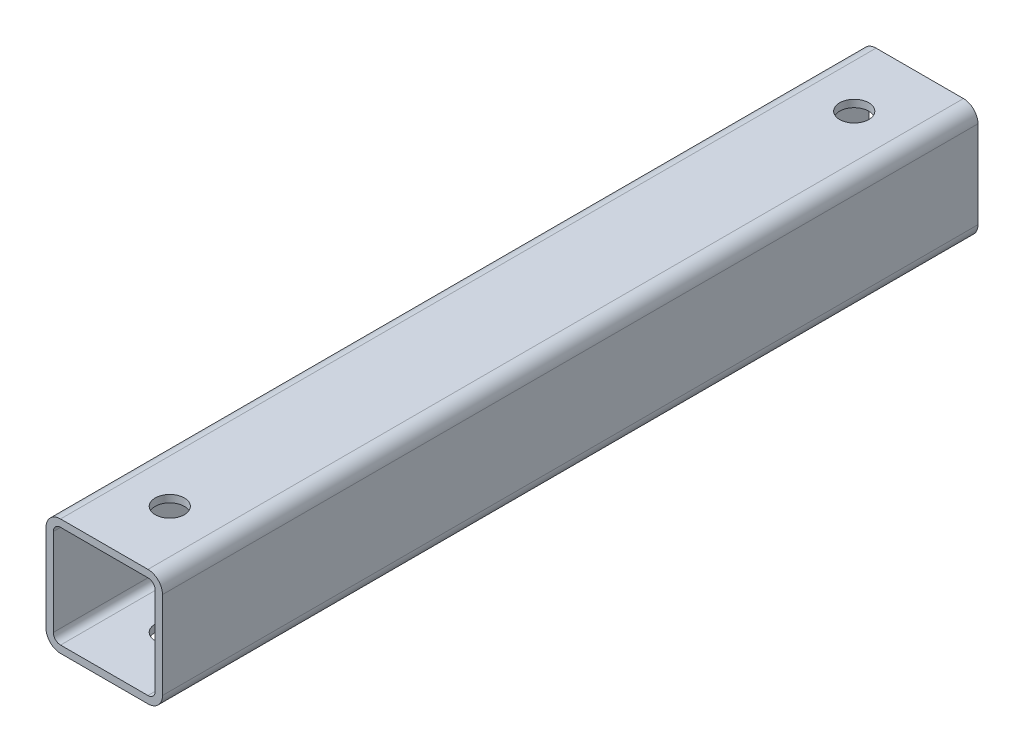
ISO-10303-21;
HEADER;
FILE_DESCRIPTION(('STEP AP214'),'2;1');
FILE_NAME('part.step','',(''),(''),'','','');
FILE_SCHEMA(('AUTOMOTIVE_DESIGN { 1 0 10303 214 1 1 1 1 }'));
ENDSEC;
DATA;
#1=APPLICATION_CONTEXT('core data for automotive mechanical design processes');
#2=APPLICATION_PROTOCOL_DEFINITION('international standard','automotive_design',2000,#1);
#3=PRODUCT_CONTEXT('',#1,'mechanical');
#4=PRODUCT('Part','Part','',(#3));
#5=PRODUCT_RELATED_PRODUCT_CATEGORY('part','',(#4));
#6=PRODUCT_DEFINITION_FORMATION('','',#4);
#7=PRODUCT_DEFINITION_CONTEXT('part definition',#1,'design');
#8=PRODUCT_DEFINITION('design','',#6,#7);
#9=PRODUCT_DEFINITION_SHAPE('','',#8);
#10=(LENGTH_UNIT() NAMED_UNIT(*) SI_UNIT(.MILLI.,.METRE.));
#11=(NAMED_UNIT(*) PLANE_ANGLE_UNIT() SI_UNIT($,.RADIAN.));
#12=(NAMED_UNIT(*) SI_UNIT($,.STERADIAN.) SOLID_ANGLE_UNIT());
#13=UNCERTAINTY_MEASURE_WITH_UNIT(LENGTH_MEASURE(1.E-05),#10,'distance_accuracy_value','');
#14=(GEOMETRIC_REPRESENTATION_CONTEXT(3) GLOBAL_UNCERTAINTY_ASSIGNED_CONTEXT((#13)) GLOBAL_UNIT_ASSIGNED_CONTEXT((#10,
#11,#12)) REPRESENTATION_CONTEXT('',''));
#15=CARTESIAN_POINT('',(0.,0.,0.));
#16=DIRECTION('',(0.,0.,1.));
#17=DIRECTION('',(1.,0.,0.));
#18=AXIS2_PLACEMENT_3D('',#15,#16,#17);
#19=CARTESIAN_POINT('',(38.1,-38.1,355.6));
#20=DIRECTION('',(0.,0.,1.));
#21=DIRECTION('',(1.,0.,0.));
#22=AXIS2_PLACEMENT_3D('',#19,#20,#21);
#23=PLANE('',#22);
#24=CARTESIAN_POINT('',(38.1,-38.1,355.6));
#25=DIRECTION('',(0.,0.,1.));
#26=DIRECTION('',(1.,0.,0.));
#27=AXIS2_PLACEMENT_3D('',#24,#25,#26);
#28=CIRCLE('',#27,12.7);
#29=CARTESIAN_POINT('',(38.1,-50.8,355.6));
#30=VERTEX_POINT('',#29);
#31=CARTESIAN_POINT('',(50.8,-38.1,355.6));
#32=VERTEX_POINT('',#31);
#33=EDGE_CURVE('E229',#30,#32,#28,.T.);
#34=ORIENTED_EDGE('',*,*,#33,.T.);
#35=DIRECTION('',(0.,1.,0.));
#36=VECTOR('',#35,1.);
#37=CARTESIAN_POINT('',(50.8,-38.1,355.6));
#38=LINE('',#37,#36);
#39=CARTESIAN_POINT('',(50.8,38.1,355.6));
#40=VERTEX_POINT('',#39);
#41=EDGE_CURVE('E232',#32,#40,#38,.T.);
#42=ORIENTED_EDGE('',*,*,#41,.T.);
#43=CARTESIAN_POINT('',(38.1,38.1,355.6));
#44=DIRECTION('',(0.,0.,1.));
#45=DIRECTION('',(-1.,0.,0.));
#46=AXIS2_PLACEMENT_3D('',#43,#44,#45);
#47=CIRCLE('',#46,12.7);
#48=CARTESIAN_POINT('',(38.1,50.8,355.6));
#49=VERTEX_POINT('',#48);
#50=EDGE_CURVE('E235',#40,#49,#47,.T.);
#51=ORIENTED_EDGE('',*,*,#50,.T.);
#52=DIRECTION('',(-1.,0.,0.));
#53=VECTOR('',#52,1.);
#54=CARTESIAN_POINT('',(-38.1,50.8,355.6));
#55=LINE('',#54,#53);
#56=CARTESIAN_POINT('',(-38.1,50.8,355.6));
#57=VERTEX_POINT('',#56);
#58=EDGE_CURVE('E237',#49,#57,#55,.T.);
#59=ORIENTED_EDGE('',*,*,#58,.T.);
#60=CARTESIAN_POINT('',(-38.1,38.1,355.6));
#61=DIRECTION('',(0.,0.,1.));
#62=DIRECTION('',(-1.,0.,0.));
#63=AXIS2_PLACEMENT_3D('',#60,#61,#62);
#64=CIRCLE('',#63,12.7);
#65=CARTESIAN_POINT('',(-50.8,38.1,355.6));
#66=VERTEX_POINT('',#65);
#67=EDGE_CURVE('E239',#57,#66,#64,.T.);
#68=ORIENTED_EDGE('',*,*,#67,.T.);
#69=DIRECTION('',(0.,-1.,0.));
#70=VECTOR('',#69,1.);
#71=CARTESIAN_POINT('',(-50.8,-38.1,355.6));
#72=LINE('',#71,#70);
#73=CARTESIAN_POINT('',(-50.8,-38.1,355.6));
#74=VERTEX_POINT('',#73);
#75=EDGE_CURVE('E241',#66,#74,#72,.T.);
#76=ORIENTED_EDGE('',*,*,#75,.T.);
#77=CARTESIAN_POINT('',(-38.1,-38.1,355.6));
#78=DIRECTION('',(0.,0.,1.));
#79=DIRECTION('',(-1.,0.,0.));
#80=AXIS2_PLACEMENT_3D('',#77,#78,#79);
#81=CIRCLE('',#80,12.7);
#82=CARTESIAN_POINT('',(-38.1,-50.8,355.6));
#83=VERTEX_POINT('',#82);
#84=EDGE_CURVE('E243',#74,#83,#81,.T.);
#85=ORIENTED_EDGE('',*,*,#84,.T.);
#86=DIRECTION('',(1.,0.,0.));
#87=VECTOR('',#86,1.);
#88=CARTESIAN_POINT('',(-38.1,-50.8,355.6));
#89=LINE('',#88,#87);
#90=EDGE_CURVE('E245',#83,#30,#89,.T.);
#91=ORIENTED_EDGE('',*,*,#90,.T.);
#92=EDGE_LOOP('',(#34,#42,#51,#59,#68,#76,#85,#91));
#93=FACE_BOUND('',#92,.T.);
#94=DIRECTION('',(0.,-1.,0.));
#95=VECTOR('',#94,1.);
#96=CARTESIAN_POINT('',(-44.45,-38.1,355.6));
#97=LINE('',#96,#95);
#98=CARTESIAN_POINT('',(-44.45,38.1,355.6));
#99=VERTEX_POINT('',#98);
#100=CARTESIAN_POINT('',(-44.45,-38.1,355.6));
#101=VERTEX_POINT('',#100);
#102=EDGE_CURVE('E170',#99,#101,#97,.T.);
#103=ORIENTED_EDGE('',*,*,#102,.F.);
#104=CARTESIAN_POINT('',(-38.1,38.1,355.6));
#105=DIRECTION('',(0.,0.,1.));
#106=DIRECTION('',(-1.,0.,0.));
#107=AXIS2_PLACEMENT_3D('',#104,#105,#106);
#108=CIRCLE('',#107,6.35);
#109=CARTESIAN_POINT('',(-38.1,44.45,355.6));
#110=VERTEX_POINT('',#109);
#111=EDGE_CURVE('E162',#110,#99,#108,.T.);
#112=ORIENTED_EDGE('',*,*,#111,.F.);
#113=DIRECTION('',(-1.,0.,0.));
#114=VECTOR('',#113,1.);
#115=CARTESIAN_POINT('',(-38.1,44.45,355.6));
#116=LINE('',#115,#114);
#117=CARTESIAN_POINT('',(38.1,44.45,355.6));
#118=VERTEX_POINT('',#117);
#119=EDGE_CURVE('E196',#118,#110,#116,.T.);
#120=ORIENTED_EDGE('',*,*,#119,.F.);
#121=CARTESIAN_POINT('',(38.1,38.1,355.6));
#122=DIRECTION('',(0.,0.,1.));
#123=DIRECTION('',(-1.,0.,0.));
#124=AXIS2_PLACEMENT_3D('',#121,#122,#123);
#125=CIRCLE('',#124,6.35);
#126=CARTESIAN_POINT('',(44.45,38.1,355.6));
#127=VERTEX_POINT('',#126);
#128=EDGE_CURVE('E194',#127,#118,#125,.T.);
#129=ORIENTED_EDGE('',*,*,#128,.F.);
#130=DIRECTION('',(0.,1.,0.));
#131=VECTOR('',#130,1.);
#132=CARTESIAN_POINT('',(44.45,-38.1,355.6));
#133=LINE('',#132,#131);
#134=CARTESIAN_POINT('',(44.45,-38.1,355.6));
#135=VERTEX_POINT('',#134);
#136=EDGE_CURVE('E192',#135,#127,#133,.T.);
#137=ORIENTED_EDGE('',*,*,#136,.F.);
#138=CARTESIAN_POINT('',(38.1,-38.1,355.6));
#139=DIRECTION('',(0.,0.,1.));
#140=DIRECTION('',(1.,0.,0.));
#141=AXIS2_PLACEMENT_3D('',#138,#139,#140);
#142=CIRCLE('',#141,6.35);
#143=CARTESIAN_POINT('',(38.1,-44.45,355.6));
#144=VERTEX_POINT('',#143);
#145=EDGE_CURVE('E190',#144,#135,#142,.T.);
#146=ORIENTED_EDGE('',*,*,#145,.F.);
#147=DIRECTION('',(1.,0.,0.));
#148=VECTOR('',#147,1.);
#149=CARTESIAN_POINT('',(-38.1,-44.45,355.6));
#150=LINE('',#149,#148);
#151=CARTESIAN_POINT('',(-38.1,-44.45,355.6));
#152=VERTEX_POINT('',#151);
#153=EDGE_CURVE('E185',#152,#144,#150,.T.);
#154=ORIENTED_EDGE('',*,*,#153,.F.);
#155=CARTESIAN_POINT('',(-38.1,-38.1,355.6));
#156=DIRECTION('',(0.,0.,1.));
#157=DIRECTION('',(-1.,0.,0.));
#158=AXIS2_PLACEMENT_3D('',#155,#156,#157);
#159=CIRCLE('',#158,6.35);
#160=EDGE_CURVE('E183',#101,#152,#159,.T.);
#161=ORIENTED_EDGE('',*,*,#160,.F.);
#162=EDGE_LOOP('',(#103,#112,#120,#129,#137,#146,#154,#161));
#163=FACE_BOUND('',#162,.T.);
#164=ADVANCED_FACE('F47',(#93,#163),#23,.T.);
#165=CARTESIAN_POINT('',(38.1,-38.1,-355.6));
#166=DIRECTION('',(0.,0.,1.));
#167=DIRECTION('',(1.,0.,0.));
#168=AXIS2_PLACEMENT_3D('',#165,#166,#167);
#169=PLANE('',#168);
#170=CARTESIAN_POINT('',(38.1,-38.1,-355.6));
#171=DIRECTION('',(0.,0.,1.));
#172=DIRECTION('',(1.,0.,0.));
#173=AXIS2_PLACEMENT_3D('',#170,#171,#172);
#174=CIRCLE('',#173,12.7);
#175=CARTESIAN_POINT('',(38.1,-50.8,-355.6));
#176=VERTEX_POINT('',#175);
#177=CARTESIAN_POINT('',(50.8,-38.1,-355.6));
#178=VERTEX_POINT('',#177);
#179=EDGE_CURVE('E178',#176,#178,#174,.T.);
#180=ORIENTED_EDGE('',*,*,#179,.F.);
#181=DIRECTION('',(1.,0.,0.));
#182=VECTOR('',#181,1.);
#183=CARTESIAN_POINT('',(-38.1,-50.8,-355.6));
#184=LINE('',#183,#182);
#185=CARTESIAN_POINT('',(-38.1,-50.8,-355.6));
#186=VERTEX_POINT('',#185);
#187=EDGE_CURVE('E233',#186,#176,#184,.T.);
#188=ORIENTED_EDGE('',*,*,#187,.F.);
#189=CARTESIAN_POINT('',(-38.1,-38.1,-355.6));
#190=DIRECTION('',(0.,0.,1.));
#191=DIRECTION('',(-1.,0.,0.));
#192=AXIS2_PLACEMENT_3D('',#189,#190,#191);
#193=CIRCLE('',#192,12.7);
#194=CARTESIAN_POINT('',(-50.8,-38.1,-355.6));
#195=VERTEX_POINT('',#194);
#196=EDGE_CURVE('E260',#195,#186,#193,.T.);
#197=ORIENTED_EDGE('',*,*,#196,.F.);
#198=DIRECTION('',(0.,-1.,0.));
#199=VECTOR('',#198,1.);
#200=CARTESIAN_POINT('',(-50.8,-38.1,-355.6));
#201=LINE('',#200,#199);
#202=CARTESIAN_POINT('',(-50.8,38.1,-355.6));
#203=VERTEX_POINT('',#202);
#204=EDGE_CURVE('E258',#203,#195,#201,.T.);
#205=ORIENTED_EDGE('',*,*,#204,.F.);
#206=CARTESIAN_POINT('',(-38.1,38.1,-355.6));
#207=DIRECTION('',(0.,0.,1.));
#208=DIRECTION('',(-1.,0.,0.));
#209=AXIS2_PLACEMENT_3D('',#206,#207,#208);
#210=CIRCLE('',#209,12.7);
#211=CARTESIAN_POINT('',(-38.1,50.8,-355.6));
#212=VERTEX_POINT('',#211);
#213=EDGE_CURVE('E256',#212,#203,#210,.T.);
#214=ORIENTED_EDGE('',*,*,#213,.F.);
#215=DIRECTION('',(-1.,0.,0.));
#216=VECTOR('',#215,1.);
#217=CARTESIAN_POINT('',(-38.1,50.8,-355.6));
#218=LINE('',#217,#216);
#219=CARTESIAN_POINT('',(38.1,50.8,-355.6));
#220=VERTEX_POINT('',#219);
#221=EDGE_CURVE('E254',#220,#212,#218,.T.);
#222=ORIENTED_EDGE('',*,*,#221,.F.);
#223=CARTESIAN_POINT('',(38.1,38.1,-355.6));
#224=DIRECTION('',(0.,0.,1.));
#225=DIRECTION('',(-1.,0.,0.));
#226=AXIS2_PLACEMENT_3D('',#223,#224,#225);
#227=CIRCLE('',#226,12.7);
#228=CARTESIAN_POINT('',(50.8,38.1,-355.6));
#229=VERTEX_POINT('',#228);
#230=EDGE_CURVE('E252',#229,#220,#227,.T.);
#231=ORIENTED_EDGE('',*,*,#230,.F.);
#232=DIRECTION('',(0.,1.,0.));
#233=VECTOR('',#232,1.);
#234=CARTESIAN_POINT('',(50.8,-38.1,-355.6));
#235=LINE('',#234,#233);
#236=EDGE_CURVE('E250',#178,#229,#235,.T.);
#237=ORIENTED_EDGE('',*,*,#236,.F.);
#238=EDGE_LOOP('',(#180,#188,#197,#205,#214,#222,#231,#237));
#239=FACE_BOUND('',#238,.T.);
#240=CARTESIAN_POINT('',(-38.1,38.1,-355.6));
#241=DIRECTION('',(0.,0.,1.));
#242=DIRECTION('',(-1.,0.,0.));
#243=AXIS2_PLACEMENT_3D('',#240,#241,#242);
#244=CIRCLE('',#243,6.35);
#245=CARTESIAN_POINT('',(-38.1,44.45,-355.6));
#246=VERTEX_POINT('',#245);
#247=CARTESIAN_POINT('',(-44.45,38.1,-355.6));
#248=VERTEX_POINT('',#247);
#249=EDGE_CURVE('E72',#246,#248,#244,.T.);
#250=ORIENTED_EDGE('',*,*,#249,.T.);
#251=DIRECTION('',(0.,-1.,0.));
#252=VECTOR('',#251,1.);
#253=CARTESIAN_POINT('',(-44.45,-38.1,-355.6));
#254=LINE('',#253,#252);
#255=CARTESIAN_POINT('',(-44.45,-38.1,-355.6));
#256=VERTEX_POINT('',#255);
#257=EDGE_CURVE('E177',#248,#256,#254,.T.);
#258=ORIENTED_EDGE('',*,*,#257,.T.);
#259=CARTESIAN_POINT('',(-38.1,-38.1,-355.6));
#260=DIRECTION('',(0.,0.,1.));
#261=DIRECTION('',(-1.,0.,0.));
#262=AXIS2_PLACEMENT_3D('',#259,#260,#261);
#263=CIRCLE('',#262,6.35);
#264=CARTESIAN_POINT('',(-38.1,-44.45,-355.6));
#265=VERTEX_POINT('',#264);
#266=EDGE_CURVE('E201',#256,#265,#263,.T.);
#267=ORIENTED_EDGE('',*,*,#266,.T.);
#268=DIRECTION('',(1.,0.,0.));
#269=VECTOR('',#268,1.);
#270=CARTESIAN_POINT('',(-38.1,-44.45,-355.6));
#271=LINE('',#270,#269);
#272=CARTESIAN_POINT('',(38.1,-44.45,-355.6));
#273=VERTEX_POINT('',#272);
#274=EDGE_CURVE('E204',#265,#273,#271,.T.);
#275=ORIENTED_EDGE('',*,*,#274,.T.);
#276=CARTESIAN_POINT('',(38.1,-38.1,-355.6));
#277=DIRECTION('',(0.,0.,1.));
#278=DIRECTION('',(1.,0.,0.));
#279=AXIS2_PLACEMENT_3D('',#276,#277,#278);
#280=CIRCLE('',#279,6.35);
#281=CARTESIAN_POINT('',(44.45,-38.1,-355.6));
#282=VERTEX_POINT('',#281);
#283=EDGE_CURVE('E207',#273,#282,#280,.T.);
#284=ORIENTED_EDGE('',*,*,#283,.T.);
#285=DIRECTION('',(0.,1.,0.));
#286=VECTOR('',#285,1.);
#287=CARTESIAN_POINT('',(44.45,-38.1,-355.6));
#288=LINE('',#287,#286);
#289=CARTESIAN_POINT('',(44.45,38.1,-355.6));
#290=VERTEX_POINT('',#289);
#291=EDGE_CURVE('E210',#282,#290,#288,.T.);
#292=ORIENTED_EDGE('',*,*,#291,.T.);
#293=CARTESIAN_POINT('',(38.1,38.1,-355.6));
#294=DIRECTION('',(0.,0.,1.));
#295=DIRECTION('',(-1.,0.,0.));
#296=AXIS2_PLACEMENT_3D('',#293,#294,#295);
#297=CIRCLE('',#296,6.35);
#298=CARTESIAN_POINT('',(38.1,44.45,-355.6));
#299=VERTEX_POINT('',#298);
#300=EDGE_CURVE('E213',#290,#299,#297,.T.);
#301=ORIENTED_EDGE('',*,*,#300,.T.);
#302=DIRECTION('',(-1.,0.,0.));
#303=VECTOR('',#302,1.);
#304=CARTESIAN_POINT('',(-38.1,44.45,-355.6));
#305=LINE('',#304,#303);
#306=EDGE_CURVE('E171',#299,#246,#305,.T.);
#307=ORIENTED_EDGE('',*,*,#306,.T.);
#308=EDGE_LOOP('',(#250,#258,#267,#275,#284,#292,#301,#307));
#309=FACE_BOUND('',#308,.T.);
#310=ADVANCED_FACE('F319',(#239,#309),#169,.F.);
#311=CARTESIAN_POINT('',(38.1,-38.1,355.6));
#312=DIRECTION('',(0.,0.,-1.));
#313=DIRECTION('',(-1.,0.,0.));
#314=AXIS2_PLACEMENT_3D('',#311,#312,#313);
#315=CYLINDRICAL_SURFACE('',#314,12.7);
#316=ORIENTED_EDGE('',*,*,#179,.T.);
#317=DIRECTION('',(0.,0.,-1.));
#318=VECTOR('',#317,1.);
#319=CARTESIAN_POINT('',(50.8,-38.1,355.6));
#320=LINE('',#319,#318);
#321=EDGE_CURVE('E11',#32,#178,#320,.T.);
#322=ORIENTED_EDGE('',*,*,#321,.F.);
#323=ORIENTED_EDGE('',*,*,#33,.F.);
#324=DIRECTION('',(0.,0.,-1.));
#325=VECTOR('',#324,1.);
#326=CARTESIAN_POINT('',(38.1,-50.8,355.6));
#327=LINE('',#326,#325);
#328=EDGE_CURVE('E247',#30,#176,#327,.T.);
#329=ORIENTED_EDGE('',*,*,#328,.T.);
#330=EDGE_LOOP('',(#316,#322,#323,#329));
#331=FACE_BOUND('',#330,.T.);
#332=ADVANCED_FACE('F49',(#331),#315,.T.);
#333=CARTESIAN_POINT('',(50.8,-38.1,355.6));
#334=DIRECTION('',(-1.,0.,0.));
#335=DIRECTION('',(0.,-1.,0.));
#336=AXIS2_PLACEMENT_3D('',#333,#334,#335);
#337=PLANE('',#336);
#338=ORIENTED_EDGE('',*,*,#236,.T.);
#339=DIRECTION('',(0.,0.,-1.));
#340=VECTOR('',#339,1.);
#341=CARTESIAN_POINT('',(50.8,38.1,355.6));
#342=LINE('',#341,#340);
#343=EDGE_CURVE('E56',#40,#229,#342,.T.);
#344=ORIENTED_EDGE('',*,*,#343,.F.);
#345=ORIENTED_EDGE('',*,*,#41,.F.);
#346=ORIENTED_EDGE('',*,*,#321,.T.);
#347=EDGE_LOOP('',(#338,#344,#345,#346));
#348=FACE_BOUND('',#347,.T.);
#349=ADVANCED_FACE('F381',(#348),#337,.F.);
#350=CARTESIAN_POINT('',(38.1,38.1,355.6));
#351=DIRECTION('',(0.,0.,-1.));
#352=DIRECTION('',(-1.,0.,0.));
#353=AXIS2_PLACEMENT_3D('',#350,#351,#352);
#354=CYLINDRICAL_SURFACE('',#353,12.7);
#355=ORIENTED_EDGE('',*,*,#230,.T.);
#356=DIRECTION('',(0.,0.,-1.));
#357=VECTOR('',#356,1.);
#358=CARTESIAN_POINT('',(38.1,50.8,355.6));
#359=LINE('',#358,#357);
#360=EDGE_CURVE('E277',#49,#220,#359,.T.);
#361=ORIENTED_EDGE('',*,*,#360,.F.);
#362=ORIENTED_EDGE('',*,*,#50,.F.);
#363=ORIENTED_EDGE('',*,*,#343,.T.);
#364=EDGE_LOOP('',(#355,#361,#362,#363));
#365=FACE_BOUND('',#364,.T.);
#366=ADVANCED_FACE('F378',(#365),#354,.T.);
#367=CARTESIAN_POINT('',(-38.1,50.8,355.6));
#368=DIRECTION('',(0.,-1.,0.));
#369=DIRECTION('',(0.,0.,-1.));
#370=AXIS2_PLACEMENT_3D('',#367,#368,#369);
#371=PLANE('',#370);
#372=CARTESIAN_POINT('',(-2.22044604925031E-13,50.8,298.449999999999));
#373=DIRECTION('',(0.,1.,0.));
#374=DIRECTION('',(0.,0.,1.));
#375=AXIS2_PLACEMENT_3D('',#372,#373,#374);
#376=CIRCLE('',#375,12.7);
#377=CARTESIAN_POINT('',(-2.22044604925031E-13,50.8,311.149999999999));
#378=VERTEX_POINT('',#377);
#379=EDGE_CURVE('E290',#378,#378,#376,.T.);
#380=ORIENTED_EDGE('',*,*,#379,.F.);
#381=EDGE_LOOP('',(#380));
#382=FACE_BOUND('',#381,.T.);
#383=CARTESIAN_POINT('',(-2.22044604925031E-13,50.8,-298.449999999999));
#384=DIRECTION('',(0.,1.,0.));
#385=DIRECTION('',(0.,0.,-1.));
#386=AXIS2_PLACEMENT_3D('',#383,#384,#385);
#387=CIRCLE('',#386,12.7);
#388=CARTESIAN_POINT('',(-2.22044604925031E-13,50.8,-311.149999999999));
#389=VERTEX_POINT('',#388);
#390=EDGE_CURVE('E295',#389,#389,#387,.T.);
#391=ORIENTED_EDGE('',*,*,#390,.F.);
#392=EDGE_LOOP('',(#391));
#393=FACE_BOUND('',#392,.T.);
#394=ORIENTED_EDGE('',*,*,#221,.T.);
#395=DIRECTION('',(0.,0.,-1.));
#396=VECTOR('',#395,1.);
#397=CARTESIAN_POINT('',(-38.1,50.8,355.6));
#398=LINE('',#397,#396);
#399=EDGE_CURVE('E274',#57,#212,#398,.T.);
#400=ORIENTED_EDGE('',*,*,#399,.F.);
#401=ORIENTED_EDGE('',*,*,#58,.F.);
#402=ORIENTED_EDGE('',*,*,#360,.T.);
#403=EDGE_LOOP('',(#394,#400,#401,#402));
#404=FACE_BOUND('',#403,.T.);
#405=ADVANCED_FACE('F374',(#382,#393,#404),#371,.F.);
#406=CARTESIAN_POINT('',(-38.1,38.1,355.6));
#407=DIRECTION('',(0.,0.,-1.));
#408=DIRECTION('',(-1.,0.,0.));
#409=AXIS2_PLACEMENT_3D('',#406,#407,#408);
#410=CYLINDRICAL_SURFACE('',#409,12.7);
#411=ORIENTED_EDGE('',*,*,#213,.T.);
#412=DIRECTION('',(0.,0.,-1.));
#413=VECTOR('',#412,1.);
#414=CARTESIAN_POINT('',(-50.8,38.1,355.6));
#415=LINE('',#414,#413);
#416=EDGE_CURVE('E271',#66,#203,#415,.T.);
#417=ORIENTED_EDGE('',*,*,#416,.F.);
#418=ORIENTED_EDGE('',*,*,#67,.F.);
#419=ORIENTED_EDGE('',*,*,#399,.T.);
#420=EDGE_LOOP('',(#411,#417,#418,#419));
#421=FACE_BOUND('',#420,.T.);
#422=ADVANCED_FACE('F370',(#421),#410,.T.);
#423=CARTESIAN_POINT('',(-50.8,-38.1,355.6));
#424=DIRECTION('',(1.,0.,0.));
#425=DIRECTION('',(0.,1.,0.));
#426=AXIS2_PLACEMENT_3D('',#423,#424,#425);
#427=PLANE('',#426);
#428=ORIENTED_EDGE('',*,*,#204,.T.);
#429=DIRECTION('',(0.,0.,-1.));
#430=VECTOR('',#429,1.);
#431=CARTESIAN_POINT('',(-50.8,-38.1,355.6));
#432=LINE('',#431,#430);
#433=EDGE_CURVE('E268',#74,#195,#432,.T.);
#434=ORIENTED_EDGE('',*,*,#433,.F.);
#435=ORIENTED_EDGE('',*,*,#75,.F.);
#436=ORIENTED_EDGE('',*,*,#416,.T.);
#437=EDGE_LOOP('',(#428,#434,#435,#436));
#438=FACE_BOUND('',#437,.T.);
#439=ADVANCED_FACE('F366',(#438),#427,.F.);
#440=CARTESIAN_POINT('',(-38.1,-38.1,355.6));
#441=DIRECTION('',(0.,0.,-1.));
#442=DIRECTION('',(-1.,0.,0.));
#443=AXIS2_PLACEMENT_3D('',#440,#441,#442);
#444=CYLINDRICAL_SURFACE('',#443,12.7);
#445=ORIENTED_EDGE('',*,*,#196,.T.);
#446=DIRECTION('',(0.,0.,-1.));
#447=VECTOR('',#446,1.);
#448=CARTESIAN_POINT('',(-38.1,-50.8,355.6));
#449=LINE('',#448,#447);
#450=EDGE_CURVE('E265',#83,#186,#449,.T.);
#451=ORIENTED_EDGE('',*,*,#450,.F.);
#452=ORIENTED_EDGE('',*,*,#84,.F.);
#453=ORIENTED_EDGE('',*,*,#433,.T.);
#454=EDGE_LOOP('',(#445,#451,#452,#453));
#455=FACE_BOUND('',#454,.T.);
#456=ADVANCED_FACE('F363',(#455),#444,.T.);
#457=CARTESIAN_POINT('',(-38.1,-50.8,355.6));
#458=DIRECTION('',(0.,1.,0.));
#459=DIRECTION('',(0.,0.,1.));
#460=AXIS2_PLACEMENT_3D('',#457,#458,#459);
#461=PLANE('',#460);
#462=CARTESIAN_POINT('',(-2.22044604925031E-13,-50.8,298.449999999999));
#463=DIRECTION('',(0.,1.,0.));
#464=DIRECTION('',(0.,0.,1.));
#465=AXIS2_PLACEMENT_3D('',#462,#463,#464);
#466=CIRCLE('',#465,12.7);
#467=CARTESIAN_POINT('',(-2.22044604925031E-13,-50.8,311.149999999999));
#468=VERTEX_POINT('',#467);
#469=EDGE_CURVE('E284',#468,#468,#466,.T.);
#470=ORIENTED_EDGE('',*,*,#469,.T.);
#471=EDGE_LOOP('',(#470));
#472=FACE_BOUND('',#471,.T.);
#473=CARTESIAN_POINT('',(-2.22044604925031E-13,-50.8,-298.449999999999));
#474=DIRECTION('',(0.,1.,0.));
#475=DIRECTION('',(0.,0.,-1.));
#476=AXIS2_PLACEMENT_3D('',#473,#474,#475);
#477=CIRCLE('',#476,12.7);
#478=CARTESIAN_POINT('',(-2.22044604925031E-13,-50.8,-311.149999999999));
#479=VERTEX_POINT('',#478);
#480=EDGE_CURVE('E300',#479,#479,#477,.T.);
#481=ORIENTED_EDGE('',*,*,#480,.T.);
#482=EDGE_LOOP('',(#481));
#483=FACE_BOUND('',#482,.T.);
#484=ORIENTED_EDGE('',*,*,#187,.T.);
#485=ORIENTED_EDGE('',*,*,#328,.F.);
#486=ORIENTED_EDGE('',*,*,#90,.F.);
#487=ORIENTED_EDGE('',*,*,#450,.T.);
#488=EDGE_LOOP('',(#484,#485,#486,#487));
#489=FACE_BOUND('',#488,.T.);
#490=ADVANCED_FACE('F360',(#472,#483,#489),#461,.F.);
#491=CARTESIAN_POINT('',(-38.1,38.1,355.6));
#492=DIRECTION('',(0.,0.,-1.));
#493=DIRECTION('',(-1.,0.,0.));
#494=AXIS2_PLACEMENT_3D('',#491,#492,#493);
#495=CYLINDRICAL_SURFACE('',#494,6.35);
#496=ORIENTED_EDGE('',*,*,#249,.F.);
#497=DIRECTION('',(0.,0.,-1.));
#498=VECTOR('',#497,1.);
#499=CARTESIAN_POINT('',(-38.1,44.45,355.6));
#500=LINE('',#499,#498);
#501=EDGE_CURVE('E166',#110,#246,#500,.T.);
#502=ORIENTED_EDGE('',*,*,#501,.F.);
#503=ORIENTED_EDGE('',*,*,#111,.T.);
#504=DIRECTION('',(0.,0.,-1.));
#505=VECTOR('',#504,1.);
#506=CARTESIAN_POINT('',(-44.45,38.1,355.6));
#507=LINE('',#506,#505);
#508=EDGE_CURVE('E165',#99,#248,#507,.T.);
#509=ORIENTED_EDGE('',*,*,#508,.T.);
#510=EDGE_LOOP('',(#496,#502,#503,#509));
#511=FACE_BOUND('',#510,.T.);
#512=ADVANCED_FACE('F164',(#511),#495,.F.);
#513=CARTESIAN_POINT('',(-44.45,-38.1,355.6));
#514=DIRECTION('',(1.,0.,0.));
#515=DIRECTION('',(0.,0.,-1.));
#516=AXIS2_PLACEMENT_3D('',#513,#514,#515);
#517=PLANE('',#516);
#518=ORIENTED_EDGE('',*,*,#257,.F.);
#519=ORIENTED_EDGE('',*,*,#508,.F.);
#520=ORIENTED_EDGE('',*,*,#102,.T.);
#521=DIRECTION('',(0.,0.,-1.));
#522=VECTOR('',#521,1.);
#523=CARTESIAN_POINT('',(-44.45,-38.1,355.6));
#524=LINE('',#523,#522);
#525=EDGE_CURVE('E179',#101,#256,#524,.T.);
#526=ORIENTED_EDGE('',*,*,#525,.T.);
#527=EDGE_LOOP('',(#518,#519,#520,#526));
#528=FACE_BOUND('',#527,.T.);
#529=ADVANCED_FACE('F174',(#528),#517,.T.);
#530=CARTESIAN_POINT('',(-38.1,-38.1,355.6));
#531=DIRECTION('',(0.,0.,-1.));
#532=DIRECTION('',(-1.,0.,0.));
#533=AXIS2_PLACEMENT_3D('',#530,#531,#532);
#534=CYLINDRICAL_SURFACE('',#533,6.35);
#535=ORIENTED_EDGE('',*,*,#266,.F.);
#536=ORIENTED_EDGE('',*,*,#525,.F.);
#537=ORIENTED_EDGE('',*,*,#160,.T.);
#538=DIRECTION('',(0.,0.,-1.));
#539=VECTOR('',#538,1.);
#540=CARTESIAN_POINT('',(-38.1,-44.45,355.6));
#541=LINE('',#540,#539);
#542=EDGE_CURVE('E226',#152,#265,#541,.T.);
#543=ORIENTED_EDGE('',*,*,#542,.T.);
#544=EDGE_LOOP('',(#535,#536,#537,#543));
#545=FACE_BOUND('',#544,.T.);
#546=ADVANCED_FACE('F339',(#545),#534,.F.);
#547=CARTESIAN_POINT('',(-38.1,-44.45,355.6));
#548=DIRECTION('',(0.,1.,0.));
#549=DIRECTION('',(0.,0.,1.));
#550=AXIS2_PLACEMENT_3D('',#547,#548,#549);
#551=PLANE('',#550);
#552=CARTESIAN_POINT('',(-2.22044604925031E-13,-44.45,298.449999999999));
#553=DIRECTION('',(0.,1.,0.));
#554=DIRECTION('',(0.,0.,1.));
#555=AXIS2_PLACEMENT_3D('',#552,#553,#554);
#556=CIRCLE('',#555,12.7);
#557=CARTESIAN_POINT('',(-2.22044604925031E-13,-44.45,311.149999999999));
#558=VERTEX_POINT('',#557);
#559=EDGE_CURVE('E199',#558,#558,#556,.T.);
#560=ORIENTED_EDGE('',*,*,#559,.F.);
#561=EDGE_LOOP('',(#560));
#562=FACE_BOUND('',#561,.T.);
#563=CARTESIAN_POINT('',(-2.22044604925031E-13,-44.45,-298.449999999999));
#564=DIRECTION('',(0.,1.,0.));
#565=DIRECTION('',(0.,0.,1.));
#566=AXIS2_PLACEMENT_3D('',#563,#564,#565);
#567=CIRCLE('',#566,12.7);
#568=CARTESIAN_POINT('',(-2.22044604925031E-13,-44.45,-285.749999999999));
#569=VERTEX_POINT('',#568);
#570=EDGE_CURVE('E283',#569,#569,#567,.T.);
#571=ORIENTED_EDGE('',*,*,#570,.F.);
#572=EDGE_LOOP('',(#571));
#573=FACE_BOUND('',#572,.T.);
#574=ORIENTED_EDGE('',*,*,#274,.F.);
#575=ORIENTED_EDGE('',*,*,#542,.F.);
#576=ORIENTED_EDGE('',*,*,#153,.T.);
#577=DIRECTION('',(0.,0.,-1.));
#578=VECTOR('',#577,1.);
#579=CARTESIAN_POINT('',(38.1,-44.45,355.6));
#580=LINE('',#579,#578);
#581=EDGE_CURVE('E224',#144,#273,#580,.T.);
#582=ORIENTED_EDGE('',*,*,#581,.T.);
#583=EDGE_LOOP('',(#574,#575,#576,#582));
#584=FACE_BOUND('',#583,.T.);
#585=ADVANCED_FACE('F335',(#562,#573,#584),#551,.T.);
#586=CARTESIAN_POINT('',(38.1,-38.1,355.6));
#587=DIRECTION('',(0.,0.,-1.));
#588=DIRECTION('',(-1.,0.,0.));
#589=AXIS2_PLACEMENT_3D('',#586,#587,#588);
#590=CYLINDRICAL_SURFACE('',#589,6.35);
#591=ORIENTED_EDGE('',*,*,#283,.F.);
#592=ORIENTED_EDGE('',*,*,#581,.F.);
#593=ORIENTED_EDGE('',*,*,#145,.T.);
#594=DIRECTION('',(0.,0.,-1.));
#595=VECTOR('',#594,1.);
#596=CARTESIAN_POINT('',(44.45,-38.1,355.6));
#597=LINE('',#596,#595);
#598=EDGE_CURVE('E222',#135,#282,#597,.T.);
#599=ORIENTED_EDGE('',*,*,#598,.T.);
#600=EDGE_LOOP('',(#591,#592,#593,#599));
#601=FACE_BOUND('',#600,.T.);
#602=ADVANCED_FACE('F331',(#601),#590,.F.);
#603=CARTESIAN_POINT('',(44.45,-38.1,355.6));
#604=DIRECTION('',(-1.,0.,0.));
#605=DIRECTION('',(0.,0.,1.));
#606=AXIS2_PLACEMENT_3D('',#603,#604,#605);
#607=PLANE('',#606);
#608=ORIENTED_EDGE('',*,*,#291,.F.);
#609=ORIENTED_EDGE('',*,*,#598,.F.);
#610=ORIENTED_EDGE('',*,*,#136,.T.);
#611=DIRECTION('',(0.,0.,-1.));
#612=VECTOR('',#611,1.);
#613=CARTESIAN_POINT('',(44.45,38.1,355.6));
#614=LINE('',#613,#612);
#615=EDGE_CURVE('E220',#127,#290,#614,.T.);
#616=ORIENTED_EDGE('',*,*,#615,.T.);
#617=EDGE_LOOP('',(#608,#609,#610,#616));
#618=FACE_BOUND('',#617,.T.);
#619=ADVANCED_FACE('F328',(#618),#607,.T.);
#620=CARTESIAN_POINT('',(38.1,38.1,355.6));
#621=DIRECTION('',(0.,0.,-1.));
#622=DIRECTION('',(-1.,0.,0.));
#623=AXIS2_PLACEMENT_3D('',#620,#621,#622);
#624=CYLINDRICAL_SURFACE('',#623,6.35);
#625=ORIENTED_EDGE('',*,*,#300,.F.);
#626=ORIENTED_EDGE('',*,*,#615,.F.);
#627=ORIENTED_EDGE('',*,*,#128,.T.);
#628=DIRECTION('',(0.,0.,-1.));
#629=VECTOR('',#628,1.);
#630=CARTESIAN_POINT('',(38.1,44.45,355.6));
#631=LINE('',#630,#629);
#632=EDGE_CURVE('E64',#118,#299,#631,.T.);
#633=ORIENTED_EDGE('',*,*,#632,.T.);
#634=EDGE_LOOP('',(#625,#626,#627,#633));
#635=FACE_BOUND('',#634,.T.);
#636=ADVANCED_FACE('F315',(#635),#624,.F.);
#637=CARTESIAN_POINT('',(-38.1,44.45,355.6));
#638=DIRECTION('',(0.,-1.,0.));
#639=DIRECTION('',(0.,0.,-1.));
#640=AXIS2_PLACEMENT_3D('',#637,#638,#639);
#641=PLANE('',#640);
#642=CARTESIAN_POINT('',(-2.22044604925031E-13,44.45,298.449999999999));
#643=DIRECTION('',(0.,-1.,0.));
#644=DIRECTION('',(0.,0.,-1.));
#645=AXIS2_PLACEMENT_3D('',#642,#643,#644);
#646=CIRCLE('',#645,12.7);
#647=CARTESIAN_POINT('',(-2.22044604925031E-13,44.45,285.749999999999));
#648=VERTEX_POINT('',#647);
#649=EDGE_CURVE('E51',#648,#648,#646,.T.);
#650=ORIENTED_EDGE('',*,*,#649,.F.);
#651=EDGE_LOOP('',(#650));
#652=FACE_BOUND('',#651,.T.);
#653=CARTESIAN_POINT('',(-2.22044604925031E-13,44.45,-298.449999999999));
#654=DIRECTION('',(0.,-1.,0.));
#655=DIRECTION('',(0.,0.,-1.));
#656=AXIS2_PLACEMENT_3D('',#653,#654,#655);
#657=CIRCLE('',#656,12.7);
#658=CARTESIAN_POINT('',(-2.22044604925031E-13,44.45,-311.149999999999));
#659=VERTEX_POINT('',#658);
#660=EDGE_CURVE('E281',#659,#659,#657,.T.);
#661=ORIENTED_EDGE('',*,*,#660,.F.);
#662=EDGE_LOOP('',(#661));
#663=FACE_BOUND('',#662,.T.);
#664=ORIENTED_EDGE('',*,*,#306,.F.);
#665=ORIENTED_EDGE('',*,*,#632,.F.);
#666=ORIENTED_EDGE('',*,*,#119,.T.);
#667=ORIENTED_EDGE('',*,*,#501,.T.);
#668=EDGE_LOOP('',(#664,#665,#666,#667));
#669=FACE_BOUND('',#668,.T.);
#670=ADVANCED_FACE('F311',(#652,#663,#669),#641,.T.);
#671=CARTESIAN_POINT('',(-2.22044604925031E-13,-50.8,-298.449999999999));
#672=DIRECTION('',(0.,1.,0.));
#673=DIRECTION('',(0.,0.,1.));
#674=AXIS2_PLACEMENT_3D('',#671,#672,#673);
#675=CYLINDRICAL_SURFACE('',#674,12.7);
#676=ORIENTED_EDGE('',*,*,#660,.T.);
#677=EDGE_LOOP('',(#676));
#678=FACE_BOUND('',#677,.T.);
#679=ORIENTED_EDGE('',*,*,#390,.T.);
#680=EDGE_LOOP('',(#679));
#681=FACE_BOUND('',#680,.T.);
#682=ADVANCED_FACE('F314',(#678,#681),#675,.F.);
#683=CARTESIAN_POINT('',(-2.22044604925031E-13,-50.8,298.449999999999));
#684=DIRECTION('',(0.,1.,0.));
#685=DIRECTION('',(0.,0.,1.));
#686=AXIS2_PLACEMENT_3D('',#683,#684,#685);
#687=CYLINDRICAL_SURFACE('',#686,12.7);
#688=ORIENTED_EDGE('',*,*,#649,.T.);
#689=EDGE_LOOP('',(#688));
#690=FACE_BOUND('',#689,.T.);
#691=ORIENTED_EDGE('',*,*,#379,.T.);
#692=EDGE_LOOP('',(#691));
#693=FACE_BOUND('',#692,.T.);
#694=ADVANCED_FACE('F308',(#690,#693),#687,.F.);
#695=ORIENTED_EDGE('',*,*,#570,.T.);
#696=EDGE_LOOP('',(#695));
#697=FACE_BOUND('',#696,.T.);
#698=ORIENTED_EDGE('',*,*,#480,.F.);
#699=EDGE_LOOP('',(#698));
#700=FACE_BOUND('',#699,.T.);
#701=ADVANCED_FACE('F514',(#697,#700),#675,.F.);
#702=ORIENTED_EDGE('',*,*,#559,.T.);
#703=EDGE_LOOP('',(#702));
#704=FACE_BOUND('',#703,.T.);
#705=ORIENTED_EDGE('',*,*,#469,.F.);
#706=EDGE_LOOP('',(#705));
#707=FACE_BOUND('',#706,.T.);
#708=ADVANCED_FACE('F522',(#704,#707),#687,.F.);
#709=CLOSED_SHELL('',(#164,#310,#332,#349,#366,#405,#422,#439,#456,#490,#512,#529,#546,#585,
#602,#619,#636,#670,#682,#694,#701,#708));
#710=MANIFOLD_SOLID_BREP('B2',#709);
#711=ADVANCED_BREP_SHAPE_REPRESENTATION('',(#18,#710),#14);
#712=SHAPE_DEFINITION_REPRESENTATION(#9,#711);
ENDSEC;
END-ISO-10303-21;
